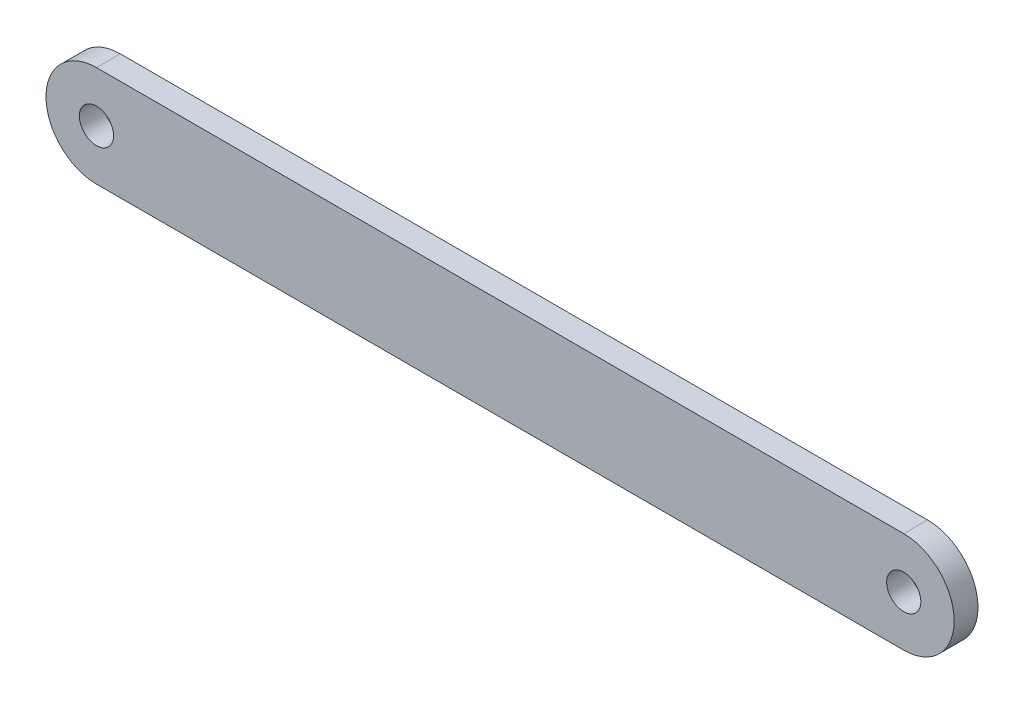
ISO-10303-21;
HEADER;
FILE_DESCRIPTION(('STEP AP214'),'2;1');
FILE_NAME('part.step','',(''),(''),'','','');
FILE_SCHEMA(('AUTOMOTIVE_DESIGN { 1 0 10303 214 1 1 1 1 }'));
ENDSEC;
DATA;
#1=APPLICATION_CONTEXT('core data for automotive mechanical design processes');
#2=APPLICATION_PROTOCOL_DEFINITION('international standard','automotive_design',2000,#1);
#3=PRODUCT_CONTEXT('',#1,'mechanical');
#4=PRODUCT('Part','Part','',(#3));
#5=PRODUCT_RELATED_PRODUCT_CATEGORY('part','',(#4));
#6=PRODUCT_DEFINITION_FORMATION('','',#4);
#7=PRODUCT_DEFINITION_CONTEXT('part definition',#1,'design');
#8=PRODUCT_DEFINITION('design','',#6,#7);
#9=PRODUCT_DEFINITION_SHAPE('','',#8);
#10=(LENGTH_UNIT() NAMED_UNIT(*) SI_UNIT(.MILLI.,.METRE.));
#11=(NAMED_UNIT(*) PLANE_ANGLE_UNIT() SI_UNIT($,.RADIAN.));
#12=(NAMED_UNIT(*) SI_UNIT($,.STERADIAN.) SOLID_ANGLE_UNIT());
#13=UNCERTAINTY_MEASURE_WITH_UNIT(LENGTH_MEASURE(1.E-05),#10,'distance_accuracy_value','');
#14=(GEOMETRIC_REPRESENTATION_CONTEXT(3) GLOBAL_UNCERTAINTY_ASSIGNED_CONTEXT((#13)) GLOBAL_UNIT_ASSIGNED_CONTEXT((#10,
#11,#12)) REPRESENTATION_CONTEXT('',''));
#15=CARTESIAN_POINT('',(0.,0.,0.));
#16=DIRECTION('',(0.,0.,1.));
#17=DIRECTION('',(1.,0.,0.));
#18=AXIS2_PLACEMENT_3D('',#15,#16,#17);
#19=CARTESIAN_POINT('',(-50.8,0.,2.9972));
#20=DIRECTION('',(0.,0.,-1.));
#21=DIRECTION('',(-1.,0.,0.));
#22=AXIS2_PLACEMENT_3D('',#19,#20,#21);
#23=CYLINDRICAL_SURFACE('',#22,6.35);
#24=CARTESIAN_POINT('',(-50.8,0.,0.));
#25=DIRECTION('',(0.,0.,1.));
#26=DIRECTION('',(1.,0.,0.));
#27=AXIS2_PLACEMENT_3D('',#24,#25,#26);
#28=CIRCLE('',#27,6.35);
#29=CARTESIAN_POINT('',(-50.8,6.35,0.));
#30=VERTEX_POINT('',#29);
#31=CARTESIAN_POINT('',(-50.8,-6.35,0.));
#32=VERTEX_POINT('',#31);
#33=EDGE_CURVE('E97',#30,#32,#28,.T.);
#34=ORIENTED_EDGE('',*,*,#33,.T.);
#35=DIRECTION('',(0.,0.,-1.));
#36=VECTOR('',#35,1.);
#37=CARTESIAN_POINT('',(-50.8,-6.35,2.9972));
#38=LINE('',#37,#36);
#39=CARTESIAN_POINT('',(-50.8,-6.35,2.9972));
#40=VERTEX_POINT('',#39);
#41=EDGE_CURVE('E11',#40,#32,#38,.T.);
#42=ORIENTED_EDGE('',*,*,#41,.F.);
#43=CARTESIAN_POINT('',(-50.8,0.,2.9972));
#44=DIRECTION('',(0.,0.,1.));
#45=DIRECTION('',(1.,0.,0.));
#46=AXIS2_PLACEMENT_3D('',#43,#44,#45);
#47=CIRCLE('',#46,6.35);
#48=CARTESIAN_POINT('',(-50.8,6.35,2.9972));
#49=VERTEX_POINT('',#48);
#50=EDGE_CURVE('E84',#49,#40,#47,.T.);
#51=ORIENTED_EDGE('',*,*,#50,.F.);
#52=DIRECTION('',(0.,0.,-1.));
#53=VECTOR('',#52,1.);
#54=CARTESIAN_POINT('',(-50.8,6.35,2.9972));
#55=LINE('',#54,#53);
#56=EDGE_CURVE('E93',#49,#30,#55,.T.);
#57=ORIENTED_EDGE('',*,*,#56,.T.);
#58=EDGE_LOOP('',(#34,#42,#51,#57));
#59=FACE_BOUND('',#58,.T.);
#60=ADVANCED_FACE('F32',(#59),#23,.T.);
#61=CARTESIAN_POINT('',(-50.8,-6.35,2.9972));
#62=DIRECTION('',(0.,1.,0.));
#63=DIRECTION('',(-1.,0.,0.));
#64=AXIS2_PLACEMENT_3D('',#61,#62,#63);
#65=PLANE('',#64);
#66=DIRECTION('',(1.,0.,0.));
#67=VECTOR('',#66,1.);
#68=CARTESIAN_POINT('',(-50.8,-6.35,0.));
#69=LINE('',#68,#67);
#70=CARTESIAN_POINT('',(50.8,-6.34999999999998,0.));
#71=VERTEX_POINT('',#70);
#72=EDGE_CURVE('E88',#32,#71,#69,.T.);
#73=ORIENTED_EDGE('',*,*,#72,.T.);
#74=DIRECTION('',(0.,0.,-1.));
#75=VECTOR('',#74,1.);
#76=CARTESIAN_POINT('',(50.8,-6.34999999999998,2.9972));
#77=LINE('',#76,#75);
#78=CARTESIAN_POINT('',(50.8,-6.34999999999998,2.9972));
#79=VERTEX_POINT('',#78);
#80=EDGE_CURVE('E41',#79,#71,#77,.T.);
#81=ORIENTED_EDGE('',*,*,#80,.F.);
#82=DIRECTION('',(1.,0.,0.));
#83=VECTOR('',#82,1.);
#84=CARTESIAN_POINT('',(-50.8,-6.35,2.9972));
#85=LINE('',#84,#83);
#86=EDGE_CURVE('E79',#40,#79,#85,.T.);
#87=ORIENTED_EDGE('',*,*,#86,.F.);
#88=ORIENTED_EDGE('',*,*,#41,.T.);
#89=EDGE_LOOP('',(#73,#81,#87,#88));
#90=FACE_BOUND('',#89,.T.);
#91=ADVANCED_FACE('F87',(#90),#65,.F.);
#92=CARTESIAN_POINT('',(50.8,0.,2.9972));
#93=DIRECTION('',(0.,0.,-1.));
#94=DIRECTION('',(-1.,0.,0.));
#95=AXIS2_PLACEMENT_3D('',#92,#93,#94);
#96=CYLINDRICAL_SURFACE('',#95,6.35);
#97=CARTESIAN_POINT('',(50.8,0.,0.));
#98=DIRECTION('',(0.,0.,1.));
#99=DIRECTION('',(1.,0.,0.));
#100=AXIS2_PLACEMENT_3D('',#97,#98,#99);
#101=CIRCLE('',#100,6.35);
#102=CARTESIAN_POINT('',(50.8,6.35000000000002,0.));
#103=VERTEX_POINT('',#102);
#104=EDGE_CURVE('E66',#71,#103,#101,.T.);
#105=ORIENTED_EDGE('',*,*,#104,.T.);
#106=DIRECTION('',(0.,0.,-1.));
#107=VECTOR('',#106,1.);
#108=CARTESIAN_POINT('',(50.8,6.35000000000002,2.9972));
#109=LINE('',#108,#107);
#110=CARTESIAN_POINT('',(50.8,6.35000000000002,2.9972));
#111=VERTEX_POINT('',#110);
#112=EDGE_CURVE('E89',#111,#103,#109,.T.);
#113=ORIENTED_EDGE('',*,*,#112,.F.);
#114=CARTESIAN_POINT('',(50.8,0.,2.9972));
#115=DIRECTION('',(0.,0.,1.));
#116=DIRECTION('',(1.,0.,0.));
#117=AXIS2_PLACEMENT_3D('',#114,#115,#116);
#118=CIRCLE('',#117,6.35);
#119=EDGE_CURVE('E82',#79,#111,#118,.T.);
#120=ORIENTED_EDGE('',*,*,#119,.F.);
#121=ORIENTED_EDGE('',*,*,#80,.T.);
#122=EDGE_LOOP('',(#105,#113,#120,#121));
#123=FACE_BOUND('',#122,.T.);
#124=ADVANCED_FACE('F91',(#123),#96,.T.);
#125=CARTESIAN_POINT('',(-50.8,6.35,2.9972));
#126=DIRECTION('',(0.,-1.,0.));
#127=DIRECTION('',(1.,0.,0.));
#128=AXIS2_PLACEMENT_3D('',#125,#126,#127);
#129=PLANE('',#128);
#130=DIRECTION('',(-1.,0.,0.));
#131=VECTOR('',#130,1.);
#132=CARTESIAN_POINT('',(-50.8,6.35,0.));
#133=LINE('',#132,#131);
#134=EDGE_CURVE('E72',#103,#30,#133,.T.);
#135=ORIENTED_EDGE('',*,*,#134,.T.);
#136=ORIENTED_EDGE('',*,*,#56,.F.);
#137=DIRECTION('',(-1.,0.,0.));
#138=VECTOR('',#137,1.);
#139=CARTESIAN_POINT('',(-50.8,6.35,2.9972));
#140=LINE('',#139,#138);
#141=EDGE_CURVE('E49',#111,#49,#140,.T.);
#142=ORIENTED_EDGE('',*,*,#141,.F.);
#143=ORIENTED_EDGE('',*,*,#112,.T.);
#144=EDGE_LOOP('',(#135,#136,#142,#143));
#145=FACE_BOUND('',#144,.T.);
#146=ADVANCED_FACE('F105',(#145),#129,.F.);
#147=CARTESIAN_POINT('',(-50.8,0.,2.9972));
#148=DIRECTION('',(0.,0.,1.));
#149=DIRECTION('',(1.,0.,0.));
#150=AXIS2_PLACEMENT_3D('',#147,#148,#149);
#151=PLANE('',#150);
#152=CARTESIAN_POINT('',(-50.8,0.,2.9972));
#153=DIRECTION('',(0.,0.,1.));
#154=DIRECTION('',(1.,0.,0.));
#155=AXIS2_PLACEMENT_3D('',#152,#153,#154);
#156=CIRCLE('',#155,2.15264999999999);
#157=CARTESIAN_POINT('',(-48.64735,0.,2.9972));
#158=VERTEX_POINT('',#157);
#159=EDGE_CURVE('E116',#158,#158,#156,.T.);
#160=ORIENTED_EDGE('',*,*,#159,.F.);
#161=EDGE_LOOP('',(#160));
#162=FACE_BOUND('',#161,.T.);
#163=CARTESIAN_POINT('',(50.8,0.,2.9972));
#164=DIRECTION('',(0.,0.,1.));
#165=DIRECTION('',(1.,0.,0.));
#166=AXIS2_PLACEMENT_3D('',#163,#164,#165);
#167=CIRCLE('',#166,2.15264999999999);
#168=CARTESIAN_POINT('',(52.95265,0.,2.9972));
#169=VERTEX_POINT('',#168);
#170=EDGE_CURVE('E113',#169,#169,#167,.T.);
#171=ORIENTED_EDGE('',*,*,#170,.F.);
#172=EDGE_LOOP('',(#171));
#173=FACE_BOUND('',#172,.T.);
#174=ORIENTED_EDGE('',*,*,#50,.T.);
#175=ORIENTED_EDGE('',*,*,#86,.T.);
#176=ORIENTED_EDGE('',*,*,#119,.T.);
#177=ORIENTED_EDGE('',*,*,#141,.T.);
#178=EDGE_LOOP('',(#174,#175,#176,#177));
#179=FACE_BOUND('',#178,.T.);
#180=ADVANCED_FACE('F80',(#162,#173,#179),#151,.T.);
#181=CARTESIAN_POINT('',(-50.8,0.,0.));
#182=DIRECTION('',(0.,0.,1.));
#183=DIRECTION('',(1.,0.,0.));
#184=AXIS2_PLACEMENT_3D('',#181,#182,#183);
#185=PLANE('',#184);
#186=CARTESIAN_POINT('',(-50.8,0.,0.));
#187=DIRECTION('',(0.,0.,1.));
#188=DIRECTION('',(1.,0.,0.));
#189=AXIS2_PLACEMENT_3D('',#186,#187,#188);
#190=CIRCLE('',#189,2.15264999999999);
#191=CARTESIAN_POINT('',(-48.64735,0.,0.));
#192=VERTEX_POINT('',#191);
#193=EDGE_CURVE('E35',#192,#192,#190,.T.);
#194=ORIENTED_EDGE('',*,*,#193,.T.);
#195=EDGE_LOOP('',(#194));
#196=FACE_BOUND('',#195,.T.);
#197=CARTESIAN_POINT('',(50.8,0.,0.));
#198=DIRECTION('',(0.,0.,1.));
#199=DIRECTION('',(1.,0.,0.));
#200=AXIS2_PLACEMENT_3D('',#197,#198,#199);
#201=CIRCLE('',#200,2.15264999999999);
#202=CARTESIAN_POINT('',(52.95265,0.,0.));
#203=VERTEX_POINT('',#202);
#204=EDGE_CURVE('E100',#203,#203,#201,.T.);
#205=ORIENTED_EDGE('',*,*,#204,.T.);
#206=EDGE_LOOP('',(#205));
#207=FACE_BOUND('',#206,.T.);
#208=ORIENTED_EDGE('',*,*,#33,.F.);
#209=ORIENTED_EDGE('',*,*,#134,.F.);
#210=ORIENTED_EDGE('',*,*,#104,.F.);
#211=ORIENTED_EDGE('',*,*,#72,.F.);
#212=EDGE_LOOP('',(#208,#209,#210,#211));
#213=FACE_BOUND('',#212,.T.);
#214=ADVANCED_FACE('F108',(#196,#207,#213),#185,.F.);
#215=CARTESIAN_POINT('',(50.8,0.,2.9972));
#216=DIRECTION('',(0.,0.,1.));
#217=DIRECTION('',(1.,0.,0.));
#218=AXIS2_PLACEMENT_3D('',#215,#216,#217);
#219=CYLINDRICAL_SURFACE('',#218,2.15264999999999);
#220=ORIENTED_EDGE('',*,*,#170,.T.);
#221=EDGE_LOOP('',(#220));
#222=FACE_BOUND('',#221,.T.);
#223=ORIENTED_EDGE('',*,*,#204,.F.);
#224=EDGE_LOOP('',(#223));
#225=FACE_BOUND('',#224,.T.);
#226=ADVANCED_FACE('F127',(#222,#225),#219,.F.);
#227=CARTESIAN_POINT('',(-50.8,0.,2.9972));
#228=DIRECTION('',(0.,0.,1.));
#229=DIRECTION('',(1.,0.,0.));
#230=AXIS2_PLACEMENT_3D('',#227,#228,#229);
#231=CYLINDRICAL_SURFACE('',#230,2.15264999999999);
#232=ORIENTED_EDGE('',*,*,#159,.T.);
#233=EDGE_LOOP('',(#232));
#234=FACE_BOUND('',#233,.T.);
#235=ORIENTED_EDGE('',*,*,#193,.F.);
#236=EDGE_LOOP('',(#235));
#237=FACE_BOUND('',#236,.T.);
#238=ADVANCED_FACE('F125',(#234,#237),#231,.F.);
#239=CLOSED_SHELL('',(#60,#91,#124,#146,#180,#214,#226,#238));
#240=MANIFOLD_SOLID_BREP('B2',#239);
#241=ADVANCED_BREP_SHAPE_REPRESENTATION('',(#18,#240),#14);
#242=SHAPE_DEFINITION_REPRESENTATION(#9,#241);
ENDSEC;
END-ISO-10303-21;
